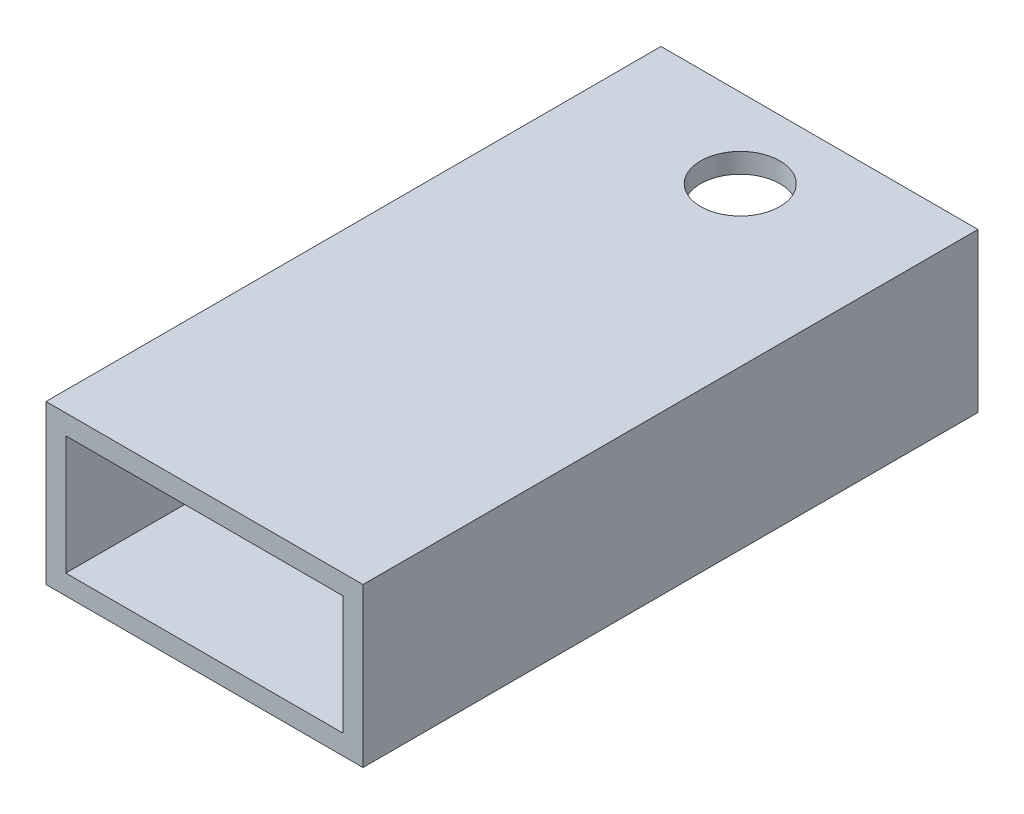
ISO-10303-21;
HEADER;
FILE_DESCRIPTION(('STEP AP214'),'2;1');
FILE_NAME('part.step','',(''),(''),'','','');
FILE_SCHEMA(('AUTOMOTIVE_DESIGN { 1 0 10303 214 1 1 1 1 }'));
ENDSEC;
DATA;
#1=APPLICATION_CONTEXT('core data for automotive mechanical design processes');
#2=APPLICATION_PROTOCOL_DEFINITION('international standard','automotive_design',2000,#1);
#3=PRODUCT_CONTEXT('',#1,'mechanical');
#4=PRODUCT('Part','Part','',(#3));
#5=PRODUCT_RELATED_PRODUCT_CATEGORY('part','',(#4));
#6=PRODUCT_DEFINITION_FORMATION('','',#4);
#7=PRODUCT_DEFINITION_CONTEXT('part definition',#1,'design');
#8=PRODUCT_DEFINITION('design','',#6,#7);
#9=PRODUCT_DEFINITION_SHAPE('','',#8);
#10=(LENGTH_UNIT() NAMED_UNIT(*) SI_UNIT(.MILLI.,.METRE.));
#11=(NAMED_UNIT(*) PLANE_ANGLE_UNIT() SI_UNIT($,.RADIAN.));
#12=(NAMED_UNIT(*) SI_UNIT($,.STERADIAN.) SOLID_ANGLE_UNIT());
#13=UNCERTAINTY_MEASURE_WITH_UNIT(LENGTH_MEASURE(1.E-05),#10,'distance_accuracy_value','');
#14=(GEOMETRIC_REPRESENTATION_CONTEXT(3) GLOBAL_UNCERTAINTY_ASSIGNED_CONTEXT((#13)) GLOBAL_UNIT_ASSIGNED_CONTEXT((#10,
#11,#12)) REPRESENTATION_CONTEXT('',''));
#15=CARTESIAN_POINT('',(0.,0.,0.));
#16=DIRECTION('',(0.,0.,1.));
#17=DIRECTION('',(1.,0.,0.));
#18=AXIS2_PLACEMENT_3D('',#15,#16,#17);
#19=CARTESIAN_POINT('',(0.,0.,98.552));
#20=DIRECTION('',(0.,0.,-1.));
#21=DIRECTION('',(-1.,0.,0.));
#22=AXIS2_PLACEMENT_3D('',#19,#20,#21);
#23=PLANE('',#22);
#24=DIRECTION('',(0.,-1.,0.));
#25=VECTOR('',#24,1.);
#26=CARTESIAN_POINT('',(0.,0.,98.552));
#27=LINE('',#26,#25);
#28=CARTESIAN_POINT('',(0.,25.4,98.552));
#29=VERTEX_POINT('',#28);
#30=CARTESIAN_POINT('',(0.,0.,98.552));
#31=VERTEX_POINT('',#30);
#32=EDGE_CURVE('E137',#29,#31,#27,.T.);
#33=ORIENTED_EDGE('',*,*,#32,.T.);
#34=DIRECTION('',(1.,0.,0.));
#35=VECTOR('',#34,1.);
#36=CARTESIAN_POINT('',(0.,0.,98.552));
#37=LINE('',#36,#35);
#38=CARTESIAN_POINT('',(50.8,0.,98.552));
#39=VERTEX_POINT('',#38);
#40=EDGE_CURVE('E140',#31,#39,#37,.T.);
#41=ORIENTED_EDGE('',*,*,#40,.T.);
#42=DIRECTION('',(0.,1.,0.));
#43=VECTOR('',#42,1.);
#44=CARTESIAN_POINT('',(50.8,0.,98.552));
#45=LINE('',#44,#43);
#46=CARTESIAN_POINT('',(50.8,25.4,98.552));
#47=VERTEX_POINT('',#46);
#48=EDGE_CURVE('E143',#39,#47,#45,.T.);
#49=ORIENTED_EDGE('',*,*,#48,.T.);
#50=DIRECTION('',(-1.,0.,0.));
#51=VECTOR('',#50,1.);
#52=CARTESIAN_POINT('',(0.,25.4,98.552));
#53=LINE('',#52,#51);
#54=EDGE_CURVE('E145',#47,#29,#53,.T.);
#55=ORIENTED_EDGE('',*,*,#54,.T.);
#56=EDGE_LOOP('',(#33,#41,#49,#55));
#57=FACE_BOUND('',#56,.T.);
#58=DIRECTION('',(0.,-1.,0.));
#59=VECTOR('',#58,1.);
#60=CARTESIAN_POINT('',(3.175,3.175,98.552));
#61=LINE('',#60,#59);
#62=CARTESIAN_POINT('',(3.175,22.225,98.552));
#63=VERTEX_POINT('',#62);
#64=CARTESIAN_POINT('',(3.175,3.175,98.552));
#65=VERTEX_POINT('',#64);
#66=EDGE_CURVE('E99',#63,#65,#61,.T.);
#67=ORIENTED_EDGE('',*,*,#66,.F.);
#68=DIRECTION('',(-1.,0.,0.));
#69=VECTOR('',#68,1.);
#70=CARTESIAN_POINT('',(3.175,22.225,98.552));
#71=LINE('',#70,#69);
#72=CARTESIAN_POINT('',(47.625,22.225,98.552));
#73=VERTEX_POINT('',#72);
#74=EDGE_CURVE('E121',#73,#63,#71,.T.);
#75=ORIENTED_EDGE('',*,*,#74,.F.);
#76=DIRECTION('',(0.,1.,0.));
#77=VECTOR('',#76,1.);
#78=CARTESIAN_POINT('',(47.625,3.175,98.552));
#79=LINE('',#78,#77);
#80=CARTESIAN_POINT('',(47.625,3.175,98.552));
#81=VERTEX_POINT('',#80);
#82=EDGE_CURVE('E119',#81,#73,#79,.T.);
#83=ORIENTED_EDGE('',*,*,#82,.F.);
#84=DIRECTION('',(1.,0.,0.));
#85=VECTOR('',#84,1.);
#86=CARTESIAN_POINT('',(3.175,3.175,98.552));
#87=LINE('',#86,#85);
#88=EDGE_CURVE('E107',#65,#81,#87,.T.);
#89=ORIENTED_EDGE('',*,*,#88,.F.);
#90=EDGE_LOOP('',(#67,#75,#83,#89));
#91=FACE_BOUND('',#90,.T.);
#92=ADVANCED_FACE('F33',(#57,#91),#23,.F.);
#93=CARTESIAN_POINT('',(0.,0.,0.));
#94=DIRECTION('',(0.,0.,-1.));
#95=DIRECTION('',(-1.,0.,0.));
#96=AXIS2_PLACEMENT_3D('',#93,#94,#95);
#97=PLANE('',#96);
#98=DIRECTION('',(0.,-1.,0.));
#99=VECTOR('',#98,1.);
#100=CARTESIAN_POINT('',(0.,0.,0.));
#101=LINE('',#100,#99);
#102=CARTESIAN_POINT('',(0.,25.4,0.));
#103=VERTEX_POINT('',#102);
#104=CARTESIAN_POINT('',(0.,0.,0.));
#105=VERTEX_POINT('',#104);
#106=EDGE_CURVE('E115',#103,#105,#101,.T.);
#107=ORIENTED_EDGE('',*,*,#106,.F.);
#108=DIRECTION('',(-1.,0.,0.));
#109=VECTOR('',#108,1.);
#110=CARTESIAN_POINT('',(0.,25.4,0.));
#111=LINE('',#110,#109);
#112=CARTESIAN_POINT('',(50.8,25.4,0.));
#113=VERTEX_POINT('',#112);
#114=EDGE_CURVE('E141',#113,#103,#111,.T.);
#115=ORIENTED_EDGE('',*,*,#114,.F.);
#116=DIRECTION('',(0.,1.,0.));
#117=VECTOR('',#116,1.);
#118=CARTESIAN_POINT('',(50.8,0.,0.));
#119=LINE('',#118,#117);
#120=CARTESIAN_POINT('',(50.8,0.,0.));
#121=VERTEX_POINT('',#120);
#122=EDGE_CURVE('E152',#121,#113,#119,.T.);
#123=ORIENTED_EDGE('',*,*,#122,.F.);
#124=DIRECTION('',(1.,0.,0.));
#125=VECTOR('',#124,1.);
#126=CARTESIAN_POINT('',(0.,0.,0.));
#127=LINE('',#126,#125);
#128=EDGE_CURVE('E150',#105,#121,#127,.T.);
#129=ORIENTED_EDGE('',*,*,#128,.F.);
#130=EDGE_LOOP('',(#107,#115,#123,#129));
#131=FACE_BOUND('',#130,.T.);
#132=DIRECTION('',(-1.,0.,0.));
#133=VECTOR('',#132,1.);
#134=CARTESIAN_POINT('',(3.175,22.225,0.));
#135=LINE('',#134,#133);
#136=CARTESIAN_POINT('',(47.625,22.225,0.));
#137=VERTEX_POINT('',#136);
#138=CARTESIAN_POINT('',(3.175,22.225,0.));
#139=VERTEX_POINT('',#138);
#140=EDGE_CURVE('E108',#137,#139,#135,.T.);
#141=ORIENTED_EDGE('',*,*,#140,.T.);
#142=DIRECTION('',(0.,-1.,0.));
#143=VECTOR('',#142,1.);
#144=CARTESIAN_POINT('',(3.175,3.175,0.));
#145=LINE('',#144,#143);
#146=CARTESIAN_POINT('',(3.175,3.175,0.));
#147=VERTEX_POINT('',#146);
#148=EDGE_CURVE('E57',#139,#147,#145,.T.);
#149=ORIENTED_EDGE('',*,*,#148,.T.);
#150=DIRECTION('',(1.,0.,0.));
#151=VECTOR('',#150,1.);
#152=CARTESIAN_POINT('',(3.175,3.175,0.));
#153=LINE('',#152,#151);
#154=CARTESIAN_POINT('',(47.625,3.175,0.));
#155=VERTEX_POINT('',#154);
#156=EDGE_CURVE('E114',#147,#155,#153,.T.);
#157=ORIENTED_EDGE('',*,*,#156,.T.);
#158=DIRECTION('',(0.,1.,0.));
#159=VECTOR('',#158,1.);
#160=CARTESIAN_POINT('',(47.625,3.175,0.));
#161=LINE('',#160,#159);
#162=EDGE_CURVE('E129',#155,#137,#161,.T.);
#163=ORIENTED_EDGE('',*,*,#162,.T.);
#164=EDGE_LOOP('',(#141,#149,#157,#163));
#165=FACE_BOUND('',#164,.T.);
#166=ADVANCED_FACE('F171',(#131,#165),#97,.T.);
#167=CARTESIAN_POINT('',(0.,0.,98.552));
#168=DIRECTION('',(1.,0.,0.));
#169=DIRECTION('',(0.,0.,-1.));
#170=AXIS2_PLACEMENT_3D('',#167,#168,#169);
#171=PLANE('',#170);
#172=ORIENTED_EDGE('',*,*,#106,.T.);
#173=DIRECTION('',(0.,0.,-1.));
#174=VECTOR('',#173,1.);
#175=CARTESIAN_POINT('',(0.,0.,98.552));
#176=LINE('',#175,#174);
#177=EDGE_CURVE('E11',#31,#105,#176,.T.);
#178=ORIENTED_EDGE('',*,*,#177,.F.);
#179=ORIENTED_EDGE('',*,*,#32,.F.);
#180=DIRECTION('',(0.,0.,-1.));
#181=VECTOR('',#180,1.);
#182=CARTESIAN_POINT('',(0.,25.4,98.552));
#183=LINE('',#182,#181);
#184=EDGE_CURVE('E147',#29,#103,#183,.T.);
#185=ORIENTED_EDGE('',*,*,#184,.T.);
#186=EDGE_LOOP('',(#172,#178,#179,#185));
#187=FACE_BOUND('',#186,.T.);
#188=ADVANCED_FACE('F35',(#187),#171,.F.);
#189=CARTESIAN_POINT('',(0.,0.,98.552));
#190=DIRECTION('',(0.,1.,0.));
#191=DIRECTION('',(0.,0.,1.));
#192=AXIS2_PLACEMENT_3D('',#189,#190,#191);
#193=PLANE('',#192);
#194=CARTESIAN_POINT('',(25.4,0.,12.7));
#195=DIRECTION('',(0.,-1.,0.));
#196=DIRECTION('',(0.,0.,-1.));
#197=AXIS2_PLACEMENT_3D('',#194,#195,#196);
#198=CIRCLE('',#197,6.35);
#199=CARTESIAN_POINT('',(25.4,0.,6.35));
#200=VERTEX_POINT('',#199);
#201=EDGE_CURVE('E208',#200,#200,#198,.T.);
#202=ORIENTED_EDGE('',*,*,#201,.F.);
#203=EDGE_LOOP('',(#202));
#204=FACE_BOUND('',#203,.T.);
#205=ORIENTED_EDGE('',*,*,#128,.T.);
#206=DIRECTION('',(0.,0.,-1.));
#207=VECTOR('',#206,1.);
#208=CARTESIAN_POINT('',(50.8,0.,98.552));
#209=LINE('',#208,#207);
#210=EDGE_CURVE('E42',#39,#121,#209,.T.);
#211=ORIENTED_EDGE('',*,*,#210,.F.);
#212=ORIENTED_EDGE('',*,*,#40,.F.);
#213=ORIENTED_EDGE('',*,*,#177,.T.);
#214=EDGE_LOOP('',(#205,#211,#212,#213));
#215=FACE_BOUND('',#214,.T.);
#216=ADVANCED_FACE('F181',(#204,#215),#193,.F.);
#217=CARTESIAN_POINT('',(50.8,0.,98.552));
#218=DIRECTION('',(-1.,0.,0.));
#219=DIRECTION('',(0.,0.,1.));
#220=AXIS2_PLACEMENT_3D('',#217,#218,#219);
#221=PLANE('',#220);
#222=ORIENTED_EDGE('',*,*,#122,.T.);
#223=DIRECTION('',(0.,0.,-1.));
#224=VECTOR('',#223,1.);
#225=CARTESIAN_POINT('',(50.8,25.4,98.552));
#226=LINE('',#225,#224);
#227=EDGE_CURVE('E157',#47,#113,#226,.T.);
#228=ORIENTED_EDGE('',*,*,#227,.F.);
#229=ORIENTED_EDGE('',*,*,#48,.F.);
#230=ORIENTED_EDGE('',*,*,#210,.T.);
#231=EDGE_LOOP('',(#222,#228,#229,#230));
#232=FACE_BOUND('',#231,.T.);
#233=ADVANCED_FACE('F165',(#232),#221,.F.);
#234=CARTESIAN_POINT('',(0.,25.4,98.552));
#235=DIRECTION('',(0.,-1.,0.));
#236=DIRECTION('',(0.,0.,-1.));
#237=AXIS2_PLACEMENT_3D('',#234,#235,#236);
#238=PLANE('',#237);
#239=CARTESIAN_POINT('',(25.4,25.4,12.7));
#240=DIRECTION('',(0.,-1.,0.));
#241=DIRECTION('',(0.,0.,-1.));
#242=AXIS2_PLACEMENT_3D('',#239,#240,#241);
#243=CIRCLE('',#242,6.35);
#244=CARTESIAN_POINT('',(25.4,25.4,6.35));
#245=VERTEX_POINT('',#244);
#246=EDGE_CURVE('E206',#245,#245,#243,.T.);
#247=ORIENTED_EDGE('',*,*,#246,.T.);
#248=EDGE_LOOP('',(#247));
#249=FACE_BOUND('',#248,.T.);
#250=ORIENTED_EDGE('',*,*,#114,.T.);
#251=ORIENTED_EDGE('',*,*,#184,.F.);
#252=ORIENTED_EDGE('',*,*,#54,.F.);
#253=ORIENTED_EDGE('',*,*,#227,.T.);
#254=EDGE_LOOP('',(#250,#251,#252,#253));
#255=FACE_BOUND('',#254,.T.);
#256=ADVANCED_FACE('F175',(#249,#255),#238,.F.);
#257=CARTESIAN_POINT('',(3.175,3.175,98.552));
#258=DIRECTION('',(1.,0.,0.));
#259=DIRECTION('',(0.,0.,-1.));
#260=AXIS2_PLACEMENT_3D('',#257,#258,#259);
#261=PLANE('',#260);
#262=ORIENTED_EDGE('',*,*,#148,.F.);
#263=DIRECTION('',(0.,0.,-1.));
#264=VECTOR('',#263,1.);
#265=CARTESIAN_POINT('',(3.175,22.225,98.552));
#266=LINE('',#265,#264);
#267=EDGE_CURVE('E103',#63,#139,#266,.T.);
#268=ORIENTED_EDGE('',*,*,#267,.F.);
#269=ORIENTED_EDGE('',*,*,#66,.T.);
#270=DIRECTION('',(0.,0.,-1.));
#271=VECTOR('',#270,1.);
#272=CARTESIAN_POINT('',(3.175,3.175,98.552));
#273=LINE('',#272,#271);
#274=EDGE_CURVE('E102',#65,#147,#273,.T.);
#275=ORIENTED_EDGE('',*,*,#274,.T.);
#276=EDGE_LOOP('',(#262,#268,#269,#275));
#277=FACE_BOUND('',#276,.T.);
#278=ADVANCED_FACE('F101',(#277),#261,.T.);
#279=CARTESIAN_POINT('',(3.175,3.175,98.552));
#280=DIRECTION('',(0.,1.,0.));
#281=DIRECTION('',(0.,0.,1.));
#282=AXIS2_PLACEMENT_3D('',#279,#280,#281);
#283=PLANE('',#282);
#284=CARTESIAN_POINT('',(25.4,3.175,12.7));
#285=DIRECTION('',(0.,1.,0.));
#286=DIRECTION('',(0.,0.,1.));
#287=AXIS2_PLACEMENT_3D('',#284,#285,#286);
#288=CIRCLE('',#287,6.35);
#289=CARTESIAN_POINT('',(25.4,3.175,19.05));
#290=VERTEX_POINT('',#289);
#291=EDGE_CURVE('E127',#290,#290,#288,.T.);
#292=ORIENTED_EDGE('',*,*,#291,.F.);
#293=EDGE_LOOP('',(#292));
#294=FACE_BOUND('',#293,.T.);
#295=ORIENTED_EDGE('',*,*,#156,.F.);
#296=ORIENTED_EDGE('',*,*,#274,.F.);
#297=ORIENTED_EDGE('',*,*,#88,.T.);
#298=DIRECTION('',(0.,0.,-1.));
#299=VECTOR('',#298,1.);
#300=CARTESIAN_POINT('',(47.625,3.175,98.552));
#301=LINE('',#300,#299);
#302=EDGE_CURVE('E116',#81,#155,#301,.T.);
#303=ORIENTED_EDGE('',*,*,#302,.T.);
#304=EDGE_LOOP('',(#295,#296,#297,#303));
#305=FACE_BOUND('',#304,.T.);
#306=ADVANCED_FACE('F111',(#294,#305),#283,.T.);
#307=CARTESIAN_POINT('',(47.625,3.175,98.552));
#308=DIRECTION('',(-1.,0.,0.));
#309=DIRECTION('',(0.,0.,1.));
#310=AXIS2_PLACEMENT_3D('',#307,#308,#309);
#311=PLANE('',#310);
#312=ORIENTED_EDGE('',*,*,#162,.F.);
#313=ORIENTED_EDGE('',*,*,#302,.F.);
#314=ORIENTED_EDGE('',*,*,#82,.T.);
#315=DIRECTION('',(0.,0.,-1.));
#316=VECTOR('',#315,1.);
#317=CARTESIAN_POINT('',(47.625,22.225,98.552));
#318=LINE('',#317,#316);
#319=EDGE_CURVE('E49',#73,#137,#318,.T.);
#320=ORIENTED_EDGE('',*,*,#319,.T.);
#321=EDGE_LOOP('',(#312,#313,#314,#320));
#322=FACE_BOUND('',#321,.T.);
#323=ADVANCED_FACE('F220',(#322),#311,.T.);
#324=CARTESIAN_POINT('',(3.175,22.225,98.552));
#325=DIRECTION('',(0.,-1.,0.));
#326=DIRECTION('',(0.,0.,-1.));
#327=AXIS2_PLACEMENT_3D('',#324,#325,#326);
#328=PLANE('',#327);
#329=CARTESIAN_POINT('',(25.4,22.225,12.7));
#330=DIRECTION('',(0.,-1.,0.));
#331=DIRECTION('',(0.,0.,-1.));
#332=AXIS2_PLACEMENT_3D('',#329,#330,#331);
#333=CIRCLE('',#332,6.35);
#334=CARTESIAN_POINT('',(25.4,22.225,6.35));
#335=VERTEX_POINT('',#334);
#336=EDGE_CURVE('E37',#335,#335,#333,.T.);
#337=ORIENTED_EDGE('',*,*,#336,.F.);
#338=EDGE_LOOP('',(#337));
#339=FACE_BOUND('',#338,.T.);
#340=ORIENTED_EDGE('',*,*,#140,.F.);
#341=ORIENTED_EDGE('',*,*,#319,.F.);
#342=ORIENTED_EDGE('',*,*,#74,.T.);
#343=ORIENTED_EDGE('',*,*,#267,.T.);
#344=EDGE_LOOP('',(#340,#341,#342,#343));
#345=FACE_BOUND('',#344,.T.);
#346=ADVANCED_FACE('F224',(#339,#345),#328,.T.);
#347=CARTESIAN_POINT('',(25.4,25.4,12.7));
#348=DIRECTION('',(0.,-1.,0.));
#349=DIRECTION('',(0.,0.,-1.));
#350=AXIS2_PLACEMENT_3D('',#347,#348,#349);
#351=CYLINDRICAL_SURFACE('',#350,6.35);
#352=ORIENTED_EDGE('',*,*,#336,.T.);
#353=EDGE_LOOP('',(#352));
#354=FACE_BOUND('',#353,.T.);
#355=ORIENTED_EDGE('',*,*,#246,.F.);
#356=EDGE_LOOP('',(#355));
#357=FACE_BOUND('',#356,.T.);
#358=ADVANCED_FACE('F230',(#354,#357),#351,.F.);
#359=ORIENTED_EDGE('',*,*,#291,.T.);
#360=EDGE_LOOP('',(#359));
#361=FACE_BOUND('',#360,.T.);
#362=ORIENTED_EDGE('',*,*,#201,.T.);
#363=EDGE_LOOP('',(#362));
#364=FACE_BOUND('',#363,.T.);
#365=ADVANCED_FACE('F216',(#361,#364),#351,.F.);
#366=CLOSED_SHELL('',(#92,#166,#188,#216,#233,#256,#278,#306,#323,#346,#358,#365));
#367=MANIFOLD_SOLID_BREP('B2',#366);
#368=ADVANCED_BREP_SHAPE_REPRESENTATION('',(#18,#367),#14);
#369=SHAPE_DEFINITION_REPRESENTATION(#9,#368);
ENDSEC;
END-ISO-10303-21;
